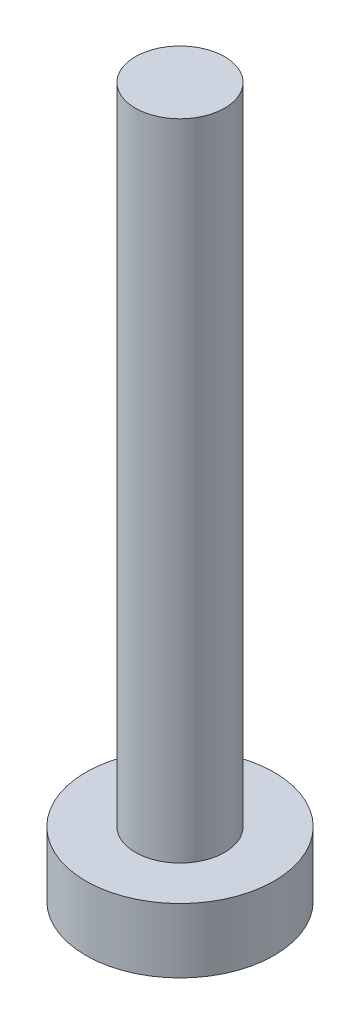
ISO-10303-21;
HEADER;
FILE_DESCRIPTION(('STEP AP214'),'2;1');
FILE_NAME('part.step','',(''),(''),'','','');
FILE_SCHEMA(('AUTOMOTIVE_DESIGN { 1 0 10303 214 1 1 1 1 }'));
ENDSEC;
DATA;
#1=APPLICATION_CONTEXT('core data for automotive mechanical design processes');
#2=APPLICATION_PROTOCOL_DEFINITION('international standard','automotive_design',2000,#1);
#3=PRODUCT_CONTEXT('',#1,'mechanical');
#4=PRODUCT('Part','Part','',(#3));
#5=PRODUCT_RELATED_PRODUCT_CATEGORY('part','',(#4));
#6=PRODUCT_DEFINITION_FORMATION('','',#4);
#7=PRODUCT_DEFINITION_CONTEXT('part definition',#1,'design');
#8=PRODUCT_DEFINITION('design','',#6,#7);
#9=PRODUCT_DEFINITION_SHAPE('','',#8);
#10=(LENGTH_UNIT() NAMED_UNIT(*) SI_UNIT(.MILLI.,.METRE.));
#11=(NAMED_UNIT(*) PLANE_ANGLE_UNIT() SI_UNIT($,.RADIAN.));
#12=(NAMED_UNIT(*) SI_UNIT($,.STERADIAN.) SOLID_ANGLE_UNIT());
#13=UNCERTAINTY_MEASURE_WITH_UNIT(LENGTH_MEASURE(1.E-05),#10,'distance_accuracy_value','');
#14=(GEOMETRIC_REPRESENTATION_CONTEXT(3) GLOBAL_UNCERTAINTY_ASSIGNED_CONTEXT((#13)) GLOBAL_UNIT_ASSIGNED_CONTEXT((#10,
#11,#12)) REPRESENTATION_CONTEXT('',''));
#15=CARTESIAN_POINT('',(0.,0.,0.));
#16=DIRECTION('',(0.,0.,1.));
#17=DIRECTION('',(1.,0.,0.));
#18=AXIS2_PLACEMENT_3D('',#15,#16,#17);
#19=CARTESIAN_POINT('',(0.,1.3,0.));
#20=DIRECTION('',(0.,-1.,0.));
#21=DIRECTION('',(0.,0.,-1.));
#22=AXIS2_PLACEMENT_3D('',#19,#20,#21);
#23=CYLINDRICAL_SURFACE('',#22,1.9);
#24=CARTESIAN_POINT('',(0.,1.3,0.));
#25=DIRECTION('',(0.,1.,0.));
#26=DIRECTION('',(0.,0.,1.));
#27=AXIS2_PLACEMENT_3D('',#24,#25,#26);
#28=CIRCLE('',#27,1.9);
#29=CARTESIAN_POINT('',(0.,1.3,1.9));
#30=VERTEX_POINT('',#29);
#31=EDGE_CURVE('E48',#30,#30,#28,.T.);
#32=ORIENTED_EDGE('',*,*,#31,.F.);
#33=EDGE_LOOP('',(#32));
#34=FACE_BOUND('',#33,.T.);
#35=CARTESIAN_POINT('',(0.,0.,0.));
#36=DIRECTION('',(0.,1.,0.));
#37=DIRECTION('',(0.,0.,1.));
#38=AXIS2_PLACEMENT_3D('',#35,#36,#37);
#39=CIRCLE('',#38,1.9);
#40=CARTESIAN_POINT('',(0.,0.,1.9));
#41=VERTEX_POINT('',#40);
#42=EDGE_CURVE('E42',#41,#41,#39,.T.);
#43=ORIENTED_EDGE('',*,*,#42,.T.);
#44=EDGE_LOOP('',(#43));
#45=FACE_BOUND('',#44,.T.);
#46=ADVANCED_FACE('F39',(#34,#45),#23,.T.);
#47=CARTESIAN_POINT('',(0.,1.3,0.));
#48=DIRECTION('',(0.,1.,0.));
#49=DIRECTION('',(0.,0.,1.));
#50=AXIS2_PLACEMENT_3D('',#47,#48,#49);
#51=PLANE('',#50);
#52=CARTESIAN_POINT('',(0.,1.3,0.));
#53=DIRECTION('',(0.,1.,0.));
#54=DIRECTION('',(0.,0.,1.));
#55=AXIS2_PLACEMENT_3D('',#52,#53,#54);
#56=CIRCLE('',#55,0.9);
#57=CARTESIAN_POINT('',(0.,1.3,-0.9));
#58=VERTEX_POINT('',#57);
#59=EDGE_CURVE('E11',#58,#58,#56,.T.);
#60=ORIENTED_EDGE('',*,*,#59,.F.);
#61=EDGE_LOOP('',(#60));
#62=FACE_BOUND('',#61,.T.);
#63=ORIENTED_EDGE('',*,*,#31,.T.);
#64=EDGE_LOOP('',(#63));
#65=FACE_BOUND('',#64,.T.);
#66=ADVANCED_FACE('F179',(#62,#65),#51,.T.);
#67=CARTESIAN_POINT('',(0.,0.,0.));
#68=DIRECTION('',(0.,1.,0.));
#69=DIRECTION('',(0.,0.,1.));
#70=AXIS2_PLACEMENT_3D('',#67,#68,#69);
#71=PLANE('',#70);
#72=DIRECTION('',(-0.5,0.,0.866025403784438));
#73=VECTOR('',#72,1.);
#74=CARTESIAN_POINT('',(0.750555349946514,0.,0.));
#75=LINE('',#74,#73);
#76=CARTESIAN_POINT('',(0.750555349946514,0.,0.));
#77=VERTEX_POINT('',#76);
#78=CARTESIAN_POINT('',(0.375277674973256,0.,0.65));
#79=VERTEX_POINT('',#78);
#80=EDGE_CURVE('E136',#77,#79,#75,.T.);
#81=ORIENTED_EDGE('',*,*,#80,.F.);
#82=DIRECTION('',(0.5,0.,0.866025403784439));
#83=VECTOR('',#82,1.);
#84=CARTESIAN_POINT('',(0.375277674973257,0.,-0.65));
#85=LINE('',#84,#83);
#86=CARTESIAN_POINT('',(0.375277674973257,0.,-0.65));
#87=VERTEX_POINT('',#86);
#88=EDGE_CURVE('E56',#87,#77,#85,.T.);
#89=ORIENTED_EDGE('',*,*,#88,.F.);
#90=DIRECTION('',(1.,0.,0.));
#91=VECTOR('',#90,1.);
#92=CARTESIAN_POINT('',(-0.375277674973257,0.,-0.65));
#93=LINE('',#92,#91);
#94=CARTESIAN_POINT('',(-0.375277674973257,0.,-0.65));
#95=VERTEX_POINT('',#94);
#96=EDGE_CURVE('E149',#95,#87,#93,.T.);
#97=ORIENTED_EDGE('',*,*,#96,.F.);
#98=DIRECTION('',(0.500000000000001,0.,-0.866025403784438));
#99=VECTOR('',#98,1.);
#100=CARTESIAN_POINT('',(-0.750555349946514,0.,0.));
#101=LINE('',#100,#99);
#102=CARTESIAN_POINT('',(-0.750555349946514,0.,0.));
#103=VERTEX_POINT('',#102);
#104=EDGE_CURVE('E146',#103,#95,#101,.T.);
#105=ORIENTED_EDGE('',*,*,#104,.F.);
#106=DIRECTION('',(-0.5,0.,-0.866025403784439));
#107=VECTOR('',#106,1.);
#108=CARTESIAN_POINT('',(-0.375277674973257,0.,0.65));
#109=LINE('',#108,#107);
#110=CARTESIAN_POINT('',(-0.375277674973257,0.,0.65));
#111=VERTEX_POINT('',#110);
#112=EDGE_CURVE('E104',#111,#103,#109,.T.);
#113=ORIENTED_EDGE('',*,*,#112,.F.);
#114=DIRECTION('',(-1.,0.,0.));
#115=VECTOR('',#114,1.);
#116=CARTESIAN_POINT('',(0.375277674973256,0.,0.65));
#117=LINE('',#116,#115);
#118=EDGE_CURVE('E140',#79,#111,#117,.T.);
#119=ORIENTED_EDGE('',*,*,#118,.F.);
#120=EDGE_LOOP('',(#81,#89,#97,#105,#113,#119));
#121=FACE_BOUND('',#120,.T.);
#122=ORIENTED_EDGE('',*,*,#42,.F.);
#123=EDGE_LOOP('',(#122));
#124=FACE_BOUND('',#123,.T.);
#125=ADVANCED_FACE('F176',(#121,#124),#71,.F.);
#126=CARTESIAN_POINT('',(0.,14.3,0.));
#127=DIRECTION('',(0.,-1.,0.));
#128=DIRECTION('',(0.,0.,-1.));
#129=AXIS2_PLACEMENT_3D('',#126,#127,#128);
#130=CYLINDRICAL_SURFACE('',#129,0.9);
#131=CARTESIAN_POINT('',(0.,14.3,0.));
#132=DIRECTION('',(0.,1.,0.));
#133=DIRECTION('',(0.,0.,1.));
#134=AXIS2_PLACEMENT_3D('',#131,#132,#133);
#135=CIRCLE('',#134,0.9);
#136=CARTESIAN_POINT('',(0.,14.3,-0.9));
#137=VERTEX_POINT('',#136);
#138=EDGE_CURVE('E155',#137,#137,#135,.T.);
#139=CARTESIAN_POINT('',(0.,14.3,-0.9));
#140=CARTESIAN_POINT('',(0.,14.1645833333333,-0.9));
#141=CARTESIAN_POINT('',(0.,14.0291666666667,-0.9));
#142=CARTESIAN_POINT('',(0.,13.7583333333333,-0.9));
#143=CARTESIAN_POINT('',(0.,13.6229166666667,-0.9));
#144=CARTESIAN_POINT('',(0.,13.3520833333333,-0.9));
#145=CARTESIAN_POINT('',(0.,13.2166666666667,-0.9));
#146=CARTESIAN_POINT('',(0.,12.9458333333333,-0.9));
#147=CARTESIAN_POINT('',(0.,12.8104166666667,-0.9));
#148=CARTESIAN_POINT('',(0.,12.5395833333333,-0.9));
#149=CARTESIAN_POINT('',(0.,12.4041666666667,-0.9));
#150=CARTESIAN_POINT('',(0.,12.1333333333333,-0.9));
#151=CARTESIAN_POINT('',(0.,11.9979166666667,-0.9));
#152=CARTESIAN_POINT('',(0.,11.7270833333333,-0.9));
#153=CARTESIAN_POINT('',(0.,11.5916666666667,-0.9));
#154=CARTESIAN_POINT('',(0.,11.3208333333333,-0.9));
#155=CARTESIAN_POINT('',(0.,11.1854166666667,-0.9));
#156=CARTESIAN_POINT('',(0.,10.9145833333333,-0.9));
#157=CARTESIAN_POINT('',(0.,10.7791666666667,-0.9));
#158=CARTESIAN_POINT('',(0.,10.5083333333333,-0.9));
#159=CARTESIAN_POINT('',(0.,10.3729166666667,-0.9));
#160=CARTESIAN_POINT('',(0.,10.1020833333333,-0.9));
#161=CARTESIAN_POINT('',(0.,9.96666666666667,-0.9));
#162=CARTESIAN_POINT('',(0.,9.69583333333333,-0.9));
#163=CARTESIAN_POINT('',(0.,9.56041666666667,-0.9));
#164=CARTESIAN_POINT('',(0.,9.28958333333333,-0.9));
#165=CARTESIAN_POINT('',(0.,9.15416666666667,-0.9));
#166=CARTESIAN_POINT('',(0.,8.88333333333333,-0.9));
#167=CARTESIAN_POINT('',(0.,8.74791666666667,-0.9));
#168=CARTESIAN_POINT('',(0.,8.47708333333333,-0.9));
#169=CARTESIAN_POINT('',(0.,8.34166666666667,-0.9));
#170=CARTESIAN_POINT('',(0.,8.07083333333333,-0.9));
#171=CARTESIAN_POINT('',(0.,7.93541666666667,-0.9));
#172=CARTESIAN_POINT('',(0.,7.66458333333333,-0.9));
#173=CARTESIAN_POINT('',(0.,7.52916666666667,-0.9));
#174=CARTESIAN_POINT('',(0.,7.25833333333333,-0.9));
#175=CARTESIAN_POINT('',(0.,7.12291666666667,-0.9));
#176=CARTESIAN_POINT('',(0.,6.85208333333333,-0.9));
#177=CARTESIAN_POINT('',(0.,6.71666666666667,-0.9));
#178=CARTESIAN_POINT('',(0.,6.44583333333333,-0.9));
#179=CARTESIAN_POINT('',(0.,6.31041666666667,-0.9));
#180=CARTESIAN_POINT('',(0.,6.03958333333333,-0.9));
#181=CARTESIAN_POINT('',(0.,5.90416666666667,-0.9));
#182=CARTESIAN_POINT('',(0.,5.63333333333333,-0.9));
#183=CARTESIAN_POINT('',(0.,5.49791666666667,-0.9));
#184=CARTESIAN_POINT('',(0.,5.22708333333333,-0.9));
#185=CARTESIAN_POINT('',(0.,5.09166666666667,-0.9));
#186=CARTESIAN_POINT('',(0.,4.82083333333333,-0.9));
#187=CARTESIAN_POINT('',(0.,4.68541666666667,-0.9));
#188=CARTESIAN_POINT('',(0.,4.41458333333333,-0.9));
#189=CARTESIAN_POINT('',(0.,4.27916666666667,-0.9));
#190=CARTESIAN_POINT('',(0.,4.00833333333333,-0.9));
#191=CARTESIAN_POINT('',(0.,3.87291666666667,-0.9));
#192=CARTESIAN_POINT('',(0.,3.60208333333333,-0.9));
#193=CARTESIAN_POINT('',(0.,3.46666666666667,-0.9));
#194=CARTESIAN_POINT('',(0.,3.19583333333333,-0.9));
#195=CARTESIAN_POINT('',(0.,3.06041666666667,-0.9));
#196=CARTESIAN_POINT('',(0.,2.78958333333333,-0.9));
#197=CARTESIAN_POINT('',(0.,2.65416666666667,-0.9));
#198=CARTESIAN_POINT('',(0.,2.38333333333333,-0.9));
#199=CARTESIAN_POINT('',(0.,2.24791666666667,-0.9));
#200=CARTESIAN_POINT('',(0.,1.97708333333333,-0.9));
#201=CARTESIAN_POINT('',(0.,1.84166666666667,-0.9));
#202=CARTESIAN_POINT('',(0.,1.57083333333333,-0.9));
#203=CARTESIAN_POINT('',(0.,1.43541666666667,-0.9));
#204=CARTESIAN_POINT('',(0.,1.3,-0.9));
#205=B_SPLINE_CURVE_WITH_KNOTS('',3,(#139,#140,#141,#142,#143,#144,#145,#146,#147,#148,#149,
#150,#151,#152,#153,#154,#155,#156,#157,#158,#159,#160,#161,#162,#163,#164,#165,#166,#167,#168,
#169,#170,#171,#172,#173,#174,#175,#176,#177,#178,#179,#180,#181,#182,#183,#184,#185,#186,#187,
#188,#189,#190,#191,#192,#193,#194,#195,#196,#197,#198,#199,#200,#201,#202,#203,#204),
.UNSPECIFIED.,.F.,.F.,(4,2,2,2,2,2,2,2,2,2,2,2,2,2,2,2,2,2,2,2,2,2,2,2,2,2,2,2,2,2,2,2,4),(0.,
0.406249999999999,0.812499999999999,1.21875,1.625,2.03125,2.4375,2.84375,3.25,3.65625,4.0625,
4.46875,4.875,5.28125,5.6875,6.09375,6.5,6.90625,7.3125,7.71875,8.125,8.53125,8.9375,9.34375,
9.75,10.15625,10.5625,10.96875,11.375,11.78125,12.1875,12.59375,13.),.UNSPECIFIED.);
#206=EDGE_CURVE('BSEAM178',#137,#58,#205,.T.);
#207=ORIENTED_EDGE('',*,*,#138,.F.);
#208=ORIENTED_EDGE('',*,*,#59,.T.);
#209=ORIENTED_EDGE('',*,*,#206,.T.);
#210=ORIENTED_EDGE('',*,*,#206,.F.);
#211=EDGE_LOOP('',(#207,#209,#208,#210));
#212=FACE_BOUND('',#211,.T.);
#213=ADVANCED_FACE('F178',(#212),#130,.T.);
#214=CARTESIAN_POINT('',(0.,14.3,0.));
#215=DIRECTION('',(0.,1.,0.));
#216=DIRECTION('',(0.,0.,1.));
#217=AXIS2_PLACEMENT_3D('',#214,#215,#216);
#218=PLANE('',#217);
#219=ORIENTED_EDGE('',*,*,#138,.T.);
#220=EDGE_LOOP('',(#219));
#221=FACE_BOUND('',#220,.T.);
#222=ADVANCED_FACE('F185',(#221),#218,.T.);
#223=CARTESIAN_POINT('',(0.375277674973257,0.7,-0.65));
#224=DIRECTION('',(0.866025403784439,0.,-0.5));
#225=DIRECTION('',(-0.5,0.,-0.866025403784439));
#226=AXIS2_PLACEMENT_3D('',#223,#224,#225);
#227=PLANE('',#226);
#228=ORIENTED_EDGE('',*,*,#88,.T.);
#229=DIRECTION('',(0.,-1.,0.));
#230=VECTOR('',#229,1.);
#231=CARTESIAN_POINT('',(0.750555349946514,0.7,0.));
#232=LINE('',#231,#230);
#233=CARTESIAN_POINT('',(0.750555349946514,0.7,0.));
#234=VERTEX_POINT('',#233);
#235=EDGE_CURVE('E86',#234,#77,#232,.T.);
#236=ORIENTED_EDGE('',*,*,#235,.F.);
#237=DIRECTION('',(0.5,0.,0.866025403784439));
#238=VECTOR('',#237,1.);
#239=CARTESIAN_POINT('',(0.375277674973257,0.7,-0.65));
#240=LINE('',#239,#238);
#241=CARTESIAN_POINT('',(0.375277674973257,0.7,-0.65));
#242=VERTEX_POINT('',#241);
#243=EDGE_CURVE('E152',#242,#234,#240,.T.);
#244=ORIENTED_EDGE('',*,*,#243,.F.);
#245=DIRECTION('',(0.,-1.,0.));
#246=VECTOR('',#245,1.);
#247=CARTESIAN_POINT('',(0.375277674973257,0.7,-0.65));
#248=LINE('',#247,#246);
#249=EDGE_CURVE('E64',#242,#87,#248,.T.);
#250=ORIENTED_EDGE('',*,*,#249,.T.);
#251=EDGE_LOOP('',(#228,#236,#244,#250));
#252=FACE_BOUND('',#251,.T.);
#253=ADVANCED_FACE('F214',(#252),#227,.F.);
#254=CARTESIAN_POINT('',(-0.375277674973257,0.7,-0.65));
#255=DIRECTION('',(0.,0.,-1.));
#256=DIRECTION('',(-1.,0.,0.));
#257=AXIS2_PLACEMENT_3D('',#254,#255,#256);
#258=PLANE('',#257);
#259=ORIENTED_EDGE('',*,*,#96,.T.);
#260=ORIENTED_EDGE('',*,*,#249,.F.);
#261=DIRECTION('',(1.,0.,0.));
#262=VECTOR('',#261,1.);
#263=CARTESIAN_POINT('',(-0.375277674973257,0.7,-0.65));
#264=LINE('',#263,#262);
#265=CARTESIAN_POINT('',(-0.375277674973257,0.7,-0.65));
#266=VERTEX_POINT('',#265);
#267=EDGE_CURVE('E118',#266,#242,#264,.T.);
#268=ORIENTED_EDGE('',*,*,#267,.F.);
#269=DIRECTION('',(0.,-1.,0.));
#270=VECTOR('',#269,1.);
#271=CARTESIAN_POINT('',(-0.375277674973257,0.7,-0.65));
#272=LINE('',#271,#270);
#273=EDGE_CURVE('E109',#266,#95,#272,.T.);
#274=ORIENTED_EDGE('',*,*,#273,.T.);
#275=EDGE_LOOP('',(#259,#260,#268,#274));
#276=FACE_BOUND('',#275,.T.);
#277=ADVANCED_FACE('F228',(#276),#258,.F.);
#278=CARTESIAN_POINT('',(-0.750555349946514,0.7,0.));
#279=DIRECTION('',(-0.866025403784438,0.,-0.5));
#280=DIRECTION('',(-0.5,0.,0.866025403784438));
#281=AXIS2_PLACEMENT_3D('',#278,#279,#280);
#282=PLANE('',#281);
#283=ORIENTED_EDGE('',*,*,#104,.T.);
#284=ORIENTED_EDGE('',*,*,#273,.F.);
#285=DIRECTION('',(0.500000000000001,0.,-0.866025403784438));
#286=VECTOR('',#285,1.);
#287=CARTESIAN_POINT('',(-0.750555349946514,0.7,0.));
#288=LINE('',#287,#286);
#289=CARTESIAN_POINT('',(-0.750555349946514,0.7,0.));
#290=VERTEX_POINT('',#289);
#291=EDGE_CURVE('E113',#290,#266,#288,.T.);
#292=ORIENTED_EDGE('',*,*,#291,.F.);
#293=DIRECTION('',(0.,-1.,0.));
#294=VECTOR('',#293,1.);
#295=CARTESIAN_POINT('',(-0.750555349946514,0.7,0.));
#296=LINE('',#295,#294);
#297=EDGE_CURVE('E97',#290,#103,#296,.T.);
#298=ORIENTED_EDGE('',*,*,#297,.T.);
#299=EDGE_LOOP('',(#283,#284,#292,#298));
#300=FACE_BOUND('',#299,.T.);
#301=ADVANCED_FACE('F114',(#300),#282,.F.);
#302=CARTESIAN_POINT('',(-0.375277674973257,0.7,0.65));
#303=DIRECTION('',(-0.866025403784439,0.,0.5));
#304=DIRECTION('',(0.5,0.,0.866025403784439));
#305=AXIS2_PLACEMENT_3D('',#302,#303,#304);
#306=PLANE('',#305);
#307=ORIENTED_EDGE('',*,*,#112,.T.);
#308=ORIENTED_EDGE('',*,*,#297,.F.);
#309=DIRECTION('',(-0.5,0.,-0.866025403784439));
#310=VECTOR('',#309,1.);
#311=CARTESIAN_POINT('',(-0.375277674973257,0.7,0.65));
#312=LINE('',#311,#310);
#313=CARTESIAN_POINT('',(-0.375277674973257,0.7,0.65));
#314=VERTEX_POINT('',#313);
#315=EDGE_CURVE('E101',#314,#290,#312,.T.);
#316=ORIENTED_EDGE('',*,*,#315,.F.);
#317=DIRECTION('',(0.,-1.,0.));
#318=VECTOR('',#317,1.);
#319=CARTESIAN_POINT('',(-0.375277674973257,0.7,0.65));
#320=LINE('',#319,#318);
#321=EDGE_CURVE('E110',#314,#111,#320,.T.);
#322=ORIENTED_EDGE('',*,*,#321,.T.);
#323=EDGE_LOOP('',(#307,#308,#316,#322));
#324=FACE_BOUND('',#323,.T.);
#325=ADVANCED_FACE('F99',(#324),#306,.F.);
#326=CARTESIAN_POINT('',(0.375277674973256,0.7,0.65));
#327=DIRECTION('',(0.,0.,1.));
#328=DIRECTION('',(1.,0.,0.));
#329=AXIS2_PLACEMENT_3D('',#326,#327,#328);
#330=PLANE('',#329);
#331=ORIENTED_EDGE('',*,*,#118,.T.);
#332=ORIENTED_EDGE('',*,*,#321,.F.);
#333=DIRECTION('',(-1.,0.,0.));
#334=VECTOR('',#333,1.);
#335=CARTESIAN_POINT('',(0.375277674973256,0.7,0.65));
#336=LINE('',#335,#334);
#337=CARTESIAN_POINT('',(0.375277674973256,0.7,0.65));
#338=VERTEX_POINT('',#337);
#339=EDGE_CURVE('E124',#338,#314,#336,.T.);
#340=ORIENTED_EDGE('',*,*,#339,.F.);
#341=DIRECTION('',(0.,-1.,0.));
#342=VECTOR('',#341,1.);
#343=CARTESIAN_POINT('',(0.375277674973256,0.7,0.65));
#344=LINE('',#343,#342);
#345=EDGE_CURVE('E160',#338,#79,#344,.T.);
#346=ORIENTED_EDGE('',*,*,#345,.T.);
#347=EDGE_LOOP('',(#331,#332,#340,#346));
#348=FACE_BOUND('',#347,.T.);
#349=ADVANCED_FACE('F253',(#348),#330,.F.);
#350=CARTESIAN_POINT('',(0.750555349946514,0.7,0.));
#351=DIRECTION('',(0.866025403784438,0.,0.5));
#352=DIRECTION('',(0.5,0.,-0.866025403784438));
#353=AXIS2_PLACEMENT_3D('',#350,#351,#352);
#354=PLANE('',#353);
#355=ORIENTED_EDGE('',*,*,#80,.T.);
#356=ORIENTED_EDGE('',*,*,#345,.F.);
#357=DIRECTION('',(-0.5,0.,0.866025403784438));
#358=VECTOR('',#357,1.);
#359=CARTESIAN_POINT('',(0.750555349946514,0.7,0.));
#360=LINE('',#359,#358);
#361=EDGE_CURVE('E128',#234,#338,#360,.T.);
#362=ORIENTED_EDGE('',*,*,#361,.F.);
#363=ORIENTED_EDGE('',*,*,#235,.T.);
#364=EDGE_LOOP('',(#355,#356,#362,#363));
#365=FACE_BOUND('',#364,.T.);
#366=ADVANCED_FACE('F262',(#365),#354,.F.);
#367=CARTESIAN_POINT('',(0.,0.7,0.));
#368=DIRECTION('',(0.,-1.,0.));
#369=DIRECTION('',(0.,0.,-1.));
#370=AXIS2_PLACEMENT_3D('',#367,#368,#369);
#371=PLANE('',#370);
#372=ORIENTED_EDGE('',*,*,#243,.T.);
#373=ORIENTED_EDGE('',*,*,#361,.T.);
#374=ORIENTED_EDGE('',*,*,#339,.T.);
#375=ORIENTED_EDGE('',*,*,#315,.T.);
#376=ORIENTED_EDGE('',*,*,#291,.T.);
#377=ORIENTED_EDGE('',*,*,#267,.T.);
#378=EDGE_LOOP('',(#372,#373,#374,#375,#376,#377));
#379=FACE_BOUND('',#378,.T.);
#380=ADVANCED_FACE('F121',(#379),#371,.T.);
#381=CLOSED_SHELL('',(#46,#66,#125,#213,#222,#253,#277,#301,#325,#349,#366,#380));
#382=MANIFOLD_SOLID_BREP('B2',#381);
#383=ADVANCED_BREP_SHAPE_REPRESENTATION('',(#18,#382),#14);
#384=SHAPE_DEFINITION_REPRESENTATION(#9,#383);
ENDSEC;
END-ISO-10303-21;
